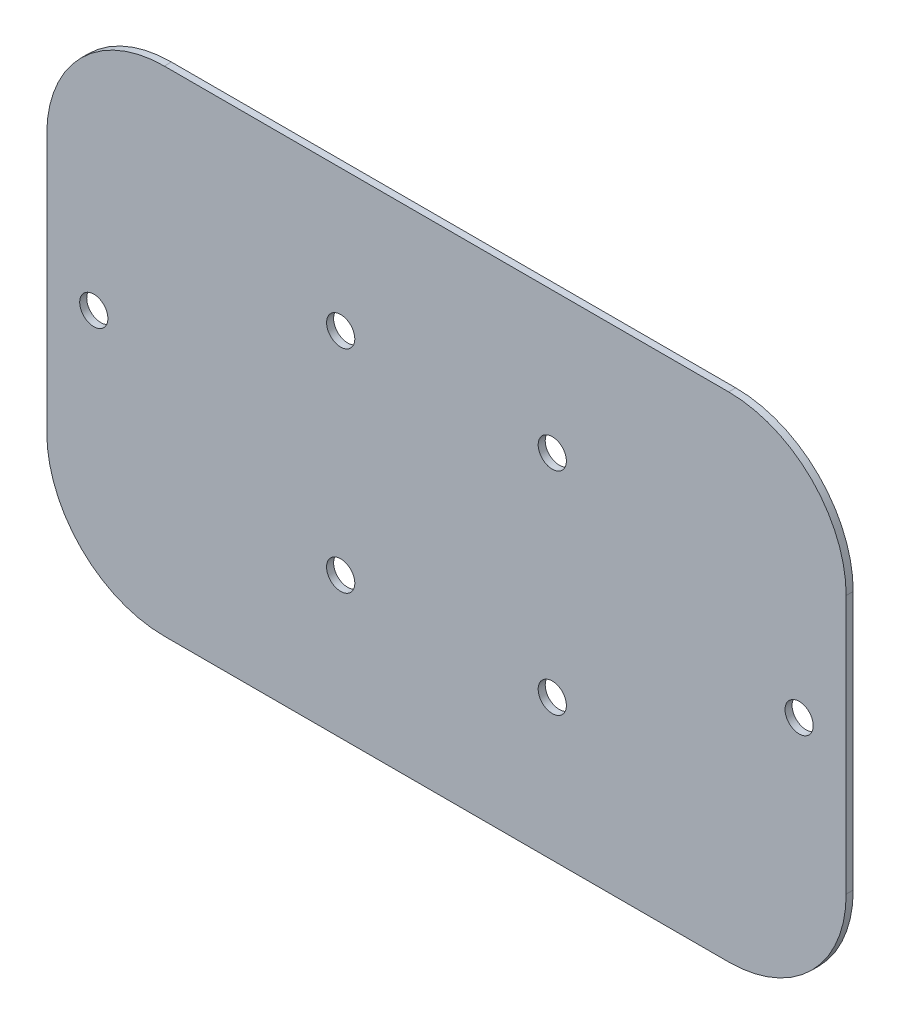
ISO-10303-21;
HEADER;
FILE_DESCRIPTION(('STEP AP214'),'2;1');
FILE_NAME('part.step','',(''),(''),'','','');
FILE_SCHEMA(('AUTOMOTIVE_DESIGN { 1 0 10303 214 1 1 1 1 }'));
ENDSEC;
DATA;
#1=APPLICATION_CONTEXT('core data for automotive mechanical design processes');
#2=APPLICATION_PROTOCOL_DEFINITION('international standard','automotive_design',2000,#1);
#3=PRODUCT_CONTEXT('',#1,'mechanical');
#4=PRODUCT('Part','Part','',(#3));
#5=PRODUCT_RELATED_PRODUCT_CATEGORY('part','',(#4));
#6=PRODUCT_DEFINITION_FORMATION('','',#4);
#7=PRODUCT_DEFINITION_CONTEXT('part definition',#1,'design');
#8=PRODUCT_DEFINITION('design','',#6,#7);
#9=PRODUCT_DEFINITION_SHAPE('','',#8);
#10=(LENGTH_UNIT() NAMED_UNIT(*) SI_UNIT(.MILLI.,.METRE.));
#11=(NAMED_UNIT(*) PLANE_ANGLE_UNIT() SI_UNIT($,.RADIAN.));
#12=(NAMED_UNIT(*) SI_UNIT($,.STERADIAN.) SOLID_ANGLE_UNIT());
#13=UNCERTAINTY_MEASURE_WITH_UNIT(LENGTH_MEASURE(1.E-05),#10,'distance_accuracy_value','');
#14=(GEOMETRIC_REPRESENTATION_CONTEXT(3) GLOBAL_UNCERTAINTY_ASSIGNED_CONTEXT((#13)) GLOBAL_UNIT_ASSIGNED_CONTEXT((#10,
#11,#12)) REPRESENTATION_CONTEXT('',''));
#15=CARTESIAN_POINT('',(0.,0.,0.));
#16=DIRECTION('',(0.,0.,1.));
#17=DIRECTION('',(1.,0.,0.));
#18=AXIS2_PLACEMENT_3D('',#15,#16,#17);
#19=CARTESIAN_POINT('',(-120.,-55.,3.));
#20=DIRECTION('',(0.,0.,-1.));
#21=DIRECTION('',(-1.,0.,0.));
#22=AXIS2_PLACEMENT_3D('',#19,#20,#21);
#23=CYLINDRICAL_SURFACE('',#22,50.);
#24=CARTESIAN_POINT('',(-120.,-55.,0.));
#25=DIRECTION('',(0.,0.,1.));
#26=DIRECTION('',(-1.,0.,0.));
#27=AXIS2_PLACEMENT_3D('',#24,#25,#26);
#28=CIRCLE('',#27,50.);
#29=CARTESIAN_POINT('',(-170.,-55.,0.));
#30=VERTEX_POINT('',#29);
#31=CARTESIAN_POINT('',(-120.,-105.,0.));
#32=VERTEX_POINT('',#31);
#33=EDGE_CURVE('E130',#30,#32,#28,.T.);
#34=ORIENTED_EDGE('',*,*,#33,.T.);
#35=DIRECTION('',(0.,0.,-1.));
#36=VECTOR('',#35,1.);
#37=CARTESIAN_POINT('',(-120.,-105.,3.));
#38=LINE('',#37,#36);
#39=CARTESIAN_POINT('',(-120.,-105.,3.));
#40=VERTEX_POINT('',#39);
#41=EDGE_CURVE('E11',#40,#32,#38,.T.);
#42=ORIENTED_EDGE('',*,*,#41,.F.);
#43=CARTESIAN_POINT('',(-120.,-55.,3.));
#44=DIRECTION('',(0.,0.,1.));
#45=DIRECTION('',(-1.,0.,0.));
#46=AXIS2_PLACEMENT_3D('',#43,#44,#45);
#47=CIRCLE('',#46,50.);
#48=CARTESIAN_POINT('',(-170.,-55.,3.));
#49=VERTEX_POINT('',#48);
#50=EDGE_CURVE('E145',#49,#40,#47,.T.);
#51=ORIENTED_EDGE('',*,*,#50,.F.);
#52=DIRECTION('',(0.,0.,-1.));
#53=VECTOR('',#52,1.);
#54=CARTESIAN_POINT('',(-170.,-55.,3.));
#55=LINE('',#54,#53);
#56=EDGE_CURVE('E126',#49,#30,#55,.T.);
#57=ORIENTED_EDGE('',*,*,#56,.T.);
#58=EDGE_LOOP('',(#34,#42,#51,#57));
#59=FACE_BOUND('',#58,.T.);
#60=ADVANCED_FACE('F34',(#59),#23,.T.);
#61=CARTESIAN_POINT('',(-120.,-105.,3.));
#62=DIRECTION('',(0.,1.,0.));
#63=DIRECTION('',(0.,0.,1.));
#64=AXIS2_PLACEMENT_3D('',#61,#62,#63);
#65=PLANE('',#64);
#66=DIRECTION('',(1.,0.,0.));
#67=VECTOR('',#66,1.);
#68=CARTESIAN_POINT('',(-120.,-105.,0.));
#69=LINE('',#68,#67);
#70=CARTESIAN_POINT('',(120.,-105.,0.));
#71=VERTEX_POINT('',#70);
#72=EDGE_CURVE('E133',#32,#71,#69,.T.);
#73=ORIENTED_EDGE('',*,*,#72,.T.);
#74=DIRECTION('',(0.,0.,-1.));
#75=VECTOR('',#74,1.);
#76=CARTESIAN_POINT('',(120.,-105.,3.));
#77=LINE('',#76,#75);
#78=CARTESIAN_POINT('',(120.,-105.,3.));
#79=VERTEX_POINT('',#78);
#80=EDGE_CURVE('E42',#79,#71,#77,.T.);
#81=ORIENTED_EDGE('',*,*,#80,.F.);
#82=DIRECTION('',(1.,0.,0.));
#83=VECTOR('',#82,1.);
#84=CARTESIAN_POINT('',(-120.,-105.,3.));
#85=LINE('',#84,#83);
#86=EDGE_CURVE('E93',#40,#79,#85,.T.);
#87=ORIENTED_EDGE('',*,*,#86,.F.);
#88=ORIENTED_EDGE('',*,*,#41,.T.);
#89=EDGE_LOOP('',(#73,#81,#87,#88));
#90=FACE_BOUND('',#89,.T.);
#91=ADVANCED_FACE('F243',(#90),#65,.F.);
#92=CARTESIAN_POINT('',(120.,-55.,3.));
#93=DIRECTION('',(0.,0.,-1.));
#94=DIRECTION('',(-1.,0.,0.));
#95=AXIS2_PLACEMENT_3D('',#92,#93,#94);
#96=CYLINDRICAL_SURFACE('',#95,50.);
#97=CARTESIAN_POINT('',(120.,-55.,0.));
#98=DIRECTION('',(0.,0.,1.));
#99=DIRECTION('',(1.,0.,0.));
#100=AXIS2_PLACEMENT_3D('',#97,#98,#99);
#101=CIRCLE('',#100,50.);
#102=CARTESIAN_POINT('',(170.,-55.,0.));
#103=VERTEX_POINT('',#102);
#104=EDGE_CURVE('E136',#71,#103,#101,.T.);
#105=ORIENTED_EDGE('',*,*,#104,.T.);
#106=DIRECTION('',(0.,0.,-1.));
#107=VECTOR('',#106,1.);
#108=CARTESIAN_POINT('',(170.,-55.,3.));
#109=LINE('',#108,#107);
#110=CARTESIAN_POINT('',(170.,-55.,3.));
#111=VERTEX_POINT('',#110);
#112=EDGE_CURVE('E152',#111,#103,#109,.T.);
#113=ORIENTED_EDGE('',*,*,#112,.F.);
#114=CARTESIAN_POINT('',(120.,-55.,3.));
#115=DIRECTION('',(0.,0.,1.));
#116=DIRECTION('',(1.,0.,0.));
#117=AXIS2_PLACEMENT_3D('',#114,#115,#116);
#118=CIRCLE('',#117,50.);
#119=EDGE_CURVE('E160',#79,#111,#118,.T.);
#120=ORIENTED_EDGE('',*,*,#119,.F.);
#121=ORIENTED_EDGE('',*,*,#80,.T.);
#122=EDGE_LOOP('',(#105,#113,#120,#121));
#123=FACE_BOUND('',#122,.T.);
#124=ADVANCED_FACE('F158',(#123),#96,.T.);
#125=CARTESIAN_POINT('',(170.,-55.,3.));
#126=DIRECTION('',(-1.,0.,0.));
#127=DIRECTION('',(0.,0.,1.));
#128=AXIS2_PLACEMENT_3D('',#125,#126,#127);
#129=PLANE('',#128);
#130=DIRECTION('',(0.,1.,0.));
#131=VECTOR('',#130,1.);
#132=CARTESIAN_POINT('',(170.,-55.,0.));
#133=LINE('',#132,#131);
#134=CARTESIAN_POINT('',(170.,55.,0.));
#135=VERTEX_POINT('',#134);
#136=EDGE_CURVE('E138',#103,#135,#133,.T.);
#137=ORIENTED_EDGE('',*,*,#136,.T.);
#138=DIRECTION('',(0.,0.,-1.));
#139=VECTOR('',#138,1.);
#140=CARTESIAN_POINT('',(170.,55.,3.));
#141=LINE('',#140,#139);
#142=CARTESIAN_POINT('',(170.,55.,3.));
#143=VERTEX_POINT('',#142);
#144=EDGE_CURVE('E149',#143,#135,#141,.T.);
#145=ORIENTED_EDGE('',*,*,#144,.F.);
#146=DIRECTION('',(0.,1.,0.));
#147=VECTOR('',#146,1.);
#148=CARTESIAN_POINT('',(170.,-55.,3.));
#149=LINE('',#148,#147);
#150=EDGE_CURVE('E172',#111,#143,#149,.T.);
#151=ORIENTED_EDGE('',*,*,#150,.F.);
#152=ORIENTED_EDGE('',*,*,#112,.T.);
#153=EDGE_LOOP('',(#137,#145,#151,#152));
#154=FACE_BOUND('',#153,.T.);
#155=ADVANCED_FACE('F168',(#154),#129,.F.);
#156=CARTESIAN_POINT('',(120.,55.,3.));
#157=DIRECTION('',(0.,0.,-1.));
#158=DIRECTION('',(-1.,0.,0.));
#159=AXIS2_PLACEMENT_3D('',#156,#157,#158);
#160=CYLINDRICAL_SURFACE('',#159,50.);
#161=CARTESIAN_POINT('',(120.,55.,0.));
#162=DIRECTION('',(0.,0.,1.));
#163=DIRECTION('',(-1.,0.,0.));
#164=AXIS2_PLACEMENT_3D('',#161,#162,#163);
#165=CIRCLE('',#164,50.);
#166=CARTESIAN_POINT('',(120.,105.,0.));
#167=VERTEX_POINT('',#166);
#168=EDGE_CURVE('E140',#135,#167,#165,.T.);
#169=ORIENTED_EDGE('',*,*,#168,.T.);
#170=DIRECTION('',(0.,0.,-1.));
#171=VECTOR('',#170,1.);
#172=CARTESIAN_POINT('',(120.,105.,3.));
#173=LINE('',#172,#171);
#174=CARTESIAN_POINT('',(120.,105.,3.));
#175=VERTEX_POINT('',#174);
#176=EDGE_CURVE('E121',#175,#167,#173,.T.);
#177=ORIENTED_EDGE('',*,*,#176,.F.);
#178=CARTESIAN_POINT('',(120.,55.,3.));
#179=DIRECTION('',(0.,0.,1.));
#180=DIRECTION('',(-1.,0.,0.));
#181=AXIS2_PLACEMENT_3D('',#178,#179,#180);
#182=CIRCLE('',#181,50.);
#183=EDGE_CURVE('E112',#143,#175,#182,.T.);
#184=ORIENTED_EDGE('',*,*,#183,.F.);
#185=ORIENTED_EDGE('',*,*,#144,.T.);
#186=EDGE_LOOP('',(#169,#177,#184,#185));
#187=FACE_BOUND('',#186,.T.);
#188=ADVANCED_FACE('F171',(#187),#160,.T.);
#189=CARTESIAN_POINT('',(-120.,105.,3.));
#190=DIRECTION('',(0.,-1.,0.));
#191=DIRECTION('',(0.,0.,-1.));
#192=AXIS2_PLACEMENT_3D('',#189,#190,#191);
#193=PLANE('',#192);
#194=DIRECTION('',(-1.,0.,0.));
#195=VECTOR('',#194,1.);
#196=CARTESIAN_POINT('',(-120.,105.,0.));
#197=LINE('',#196,#195);
#198=CARTESIAN_POINT('',(-120.,105.,0.));
#199=VERTEX_POINT('',#198);
#200=EDGE_CURVE('E120',#167,#199,#197,.T.);
#201=ORIENTED_EDGE('',*,*,#200,.T.);
#202=DIRECTION('',(0.,0.,-1.));
#203=VECTOR('',#202,1.);
#204=CARTESIAN_POINT('',(-120.,105.,3.));
#205=LINE('',#204,#203);
#206=CARTESIAN_POINT('',(-120.,105.,3.));
#207=VERTEX_POINT('',#206);
#208=EDGE_CURVE('E117',#207,#199,#205,.T.);
#209=ORIENTED_EDGE('',*,*,#208,.F.);
#210=DIRECTION('',(-1.,0.,0.));
#211=VECTOR('',#210,1.);
#212=CARTESIAN_POINT('',(-120.,105.,3.));
#213=LINE('',#212,#211);
#214=EDGE_CURVE('E106',#175,#207,#213,.T.);
#215=ORIENTED_EDGE('',*,*,#214,.F.);
#216=ORIENTED_EDGE('',*,*,#176,.T.);
#217=EDGE_LOOP('',(#201,#209,#215,#216));
#218=FACE_BOUND('',#217,.T.);
#219=ADVANCED_FACE('F118',(#218),#193,.F.);
#220=CARTESIAN_POINT('',(-120.,55.,3.));
#221=DIRECTION('',(0.,0.,-1.));
#222=DIRECTION('',(-1.,0.,0.));
#223=AXIS2_PLACEMENT_3D('',#220,#221,#222);
#224=CYLINDRICAL_SURFACE('',#223,50.);
#225=CARTESIAN_POINT('',(-120.,55.,0.));
#226=DIRECTION('',(0.,0.,1.));
#227=DIRECTION('',(-1.,0.,0.));
#228=AXIS2_PLACEMENT_3D('',#225,#226,#227);
#229=CIRCLE('',#228,50.);
#230=CARTESIAN_POINT('',(-170.,55.,0.));
#231=VERTEX_POINT('',#230);
#232=EDGE_CURVE('E79',#199,#231,#229,.T.);
#233=ORIENTED_EDGE('',*,*,#232,.T.);
#234=DIRECTION('',(0.,0.,-1.));
#235=VECTOR('',#234,1.);
#236=CARTESIAN_POINT('',(-170.,55.,3.));
#237=LINE('',#236,#235);
#238=CARTESIAN_POINT('',(-170.,55.,3.));
#239=VERTEX_POINT('',#238);
#240=EDGE_CURVE('E122',#239,#231,#237,.T.);
#241=ORIENTED_EDGE('',*,*,#240,.F.);
#242=CARTESIAN_POINT('',(-120.,55.,3.));
#243=DIRECTION('',(0.,0.,1.));
#244=DIRECTION('',(-1.,0.,0.));
#245=AXIS2_PLACEMENT_3D('',#242,#243,#244);
#246=CIRCLE('',#245,50.);
#247=EDGE_CURVE('E110',#207,#239,#246,.T.);
#248=ORIENTED_EDGE('',*,*,#247,.F.);
#249=ORIENTED_EDGE('',*,*,#208,.T.);
#250=EDGE_LOOP('',(#233,#241,#248,#249));
#251=FACE_BOUND('',#250,.T.);
#252=ADVANCED_FACE('F124',(#251),#224,.T.);
#253=CARTESIAN_POINT('',(-170.,-55.,3.));
#254=DIRECTION('',(1.,0.,0.));
#255=DIRECTION('',(0.,0.,-1.));
#256=AXIS2_PLACEMENT_3D('',#253,#254,#255);
#257=PLANE('',#256);
#258=DIRECTION('',(0.,-1.,0.));
#259=VECTOR('',#258,1.);
#260=CARTESIAN_POINT('',(-170.,-55.,0.));
#261=LINE('',#260,#259);
#262=EDGE_CURVE('E85',#231,#30,#261,.T.);
#263=ORIENTED_EDGE('',*,*,#262,.T.);
#264=ORIENTED_EDGE('',*,*,#56,.F.);
#265=DIRECTION('',(0.,-1.,0.));
#266=VECTOR('',#265,1.);
#267=CARTESIAN_POINT('',(-170.,-55.,3.));
#268=LINE('',#267,#266);
#269=EDGE_CURVE('E50',#239,#49,#268,.T.);
#270=ORIENTED_EDGE('',*,*,#269,.F.);
#271=ORIENTED_EDGE('',*,*,#240,.T.);
#272=EDGE_LOOP('',(#263,#264,#270,#271));
#273=FACE_BOUND('',#272,.T.);
#274=ADVANCED_FACE('F250',(#273),#257,.F.);
#275=CARTESIAN_POINT('',(-120.,-55.,3.));
#276=DIRECTION('',(0.,0.,-1.));
#277=DIRECTION('',(-1.,0.,0.));
#278=AXIS2_PLACEMENT_3D('',#275,#276,#277);
#279=PLANE('',#278);
#280=CARTESIAN_POINT('',(-45.,45.,3.));
#281=DIRECTION('',(0.,0.,-1.));
#282=DIRECTION('',(-1.,0.,0.));
#283=AXIS2_PLACEMENT_3D('',#280,#281,#282);
#284=CIRCLE('',#283,5.99999999999991);
#285=CARTESIAN_POINT('',(-50.9999999999999,45.,3.));
#286=VERTEX_POINT('',#285);
#287=EDGE_CURVE('E207',#286,#286,#284,.T.);
#288=ORIENTED_EDGE('',*,*,#287,.T.);
#289=EDGE_LOOP('',(#288));
#290=FACE_BOUND('',#289,.T.);
#291=CARTESIAN_POINT('',(45.,45.,3.));
#292=DIRECTION('',(0.,0.,-1.));
#293=DIRECTION('',(-1.,0.,0.));
#294=AXIS2_PLACEMENT_3D('',#291,#292,#293);
#295=CIRCLE('',#294,5.99999999999991);
#296=CARTESIAN_POINT('',(39.0000000000001,45.,3.));
#297=VERTEX_POINT('',#296);
#298=EDGE_CURVE('E201',#297,#297,#295,.T.);
#299=ORIENTED_EDGE('',*,*,#298,.T.);
#300=EDGE_LOOP('',(#299));
#301=FACE_BOUND('',#300,.T.);
#302=CARTESIAN_POINT('',(-45.,-45.,3.));
#303=DIRECTION('',(0.,0.,-1.));
#304=DIRECTION('',(-1.,0.,0.));
#305=AXIS2_PLACEMENT_3D('',#302,#303,#304);
#306=CIRCLE('',#305,5.99999999999991);
#307=CARTESIAN_POINT('',(-50.9999999999999,-45.,3.));
#308=VERTEX_POINT('',#307);
#309=EDGE_CURVE('E195',#308,#308,#306,.T.);
#310=ORIENTED_EDGE('',*,*,#309,.T.);
#311=EDGE_LOOP('',(#310));
#312=FACE_BOUND('',#311,.T.);
#313=CARTESIAN_POINT('',(45.,-45.,3.));
#314=DIRECTION('',(0.,0.,-1.));
#315=DIRECTION('',(-1.,0.,0.));
#316=AXIS2_PLACEMENT_3D('',#313,#314,#315);
#317=CIRCLE('',#316,5.99999999999991);
#318=CARTESIAN_POINT('',(39.0000000000001,-45.,3.));
#319=VERTEX_POINT('',#318);
#320=EDGE_CURVE('E189',#319,#319,#317,.T.);
#321=ORIENTED_EDGE('',*,*,#320,.T.);
#322=EDGE_LOOP('',(#321));
#323=FACE_BOUND('',#322,.T.);
#324=CARTESIAN_POINT('',(150.,0.,3.));
#325=DIRECTION('',(0.,0.,-1.));
#326=DIRECTION('',(-1.,0.,0.));
#327=AXIS2_PLACEMENT_3D('',#324,#325,#326);
#328=CIRCLE('',#327,5.99999999999992);
#329=CARTESIAN_POINT('',(144.,0.,3.));
#330=VERTEX_POINT('',#329);
#331=EDGE_CURVE('E183',#330,#330,#328,.T.);
#332=ORIENTED_EDGE('',*,*,#331,.T.);
#333=EDGE_LOOP('',(#332));
#334=FACE_BOUND('',#333,.T.);
#335=CARTESIAN_POINT('',(-150.,0.,3.));
#336=DIRECTION('',(0.,0.,-1.));
#337=DIRECTION('',(-1.,0.,0.));
#338=AXIS2_PLACEMENT_3D('',#335,#336,#337);
#339=CIRCLE('',#338,5.99999999999992);
#340=CARTESIAN_POINT('',(-156.,0.,3.));
#341=VERTEX_POINT('',#340);
#342=EDGE_CURVE('E134',#341,#341,#339,.T.);
#343=ORIENTED_EDGE('',*,*,#342,.T.);
#344=EDGE_LOOP('',(#343));
#345=FACE_BOUND('',#344,.T.);
#346=ORIENTED_EDGE('',*,*,#50,.T.);
#347=ORIENTED_EDGE('',*,*,#86,.T.);
#348=ORIENTED_EDGE('',*,*,#119,.T.);
#349=ORIENTED_EDGE('',*,*,#150,.T.);
#350=ORIENTED_EDGE('',*,*,#183,.T.);
#351=ORIENTED_EDGE('',*,*,#214,.T.);
#352=ORIENTED_EDGE('',*,*,#247,.T.);
#353=ORIENTED_EDGE('',*,*,#269,.T.);
#354=EDGE_LOOP('',(#346,#347,#348,#349,#350,#351,#352,#353));
#355=FACE_BOUND('',#354,.T.);
#356=ADVANCED_FACE('F108',(#290,#301,#312,#323,#334,#345,#355),#279,.F.);
#357=CARTESIAN_POINT('',(-120.,-55.,0.));
#358=DIRECTION('',(0.,0.,-1.));
#359=DIRECTION('',(-1.,0.,0.));
#360=AXIS2_PLACEMENT_3D('',#357,#358,#359);
#361=PLANE('',#360);
#362=CARTESIAN_POINT('',(-45.,45.,0.));
#363=DIRECTION('',(0.,0.,-1.));
#364=DIRECTION('',(-1.,0.,0.));
#365=AXIS2_PLACEMENT_3D('',#362,#363,#364);
#366=CIRCLE('',#365,5.99999999999998);
#367=CARTESIAN_POINT('',(-51.,45.,0.));
#368=VERTEX_POINT('',#367);
#369=EDGE_CURVE('E210',#368,#368,#366,.T.);
#370=ORIENTED_EDGE('',*,*,#369,.F.);
#371=EDGE_LOOP('',(#370));
#372=FACE_BOUND('',#371,.T.);
#373=CARTESIAN_POINT('',(45.,45.,0.));
#374=DIRECTION('',(0.,0.,-1.));
#375=DIRECTION('',(-1.,0.,0.));
#376=AXIS2_PLACEMENT_3D('',#373,#374,#375);
#377=CIRCLE('',#376,5.99999999999998);
#378=CARTESIAN_POINT('',(39.,45.,0.));
#379=VERTEX_POINT('',#378);
#380=EDGE_CURVE('E204',#379,#379,#377,.T.);
#381=ORIENTED_EDGE('',*,*,#380,.F.);
#382=EDGE_LOOP('',(#381));
#383=FACE_BOUND('',#382,.T.);
#384=CARTESIAN_POINT('',(-45.,-45.,0.));
#385=DIRECTION('',(0.,0.,-1.));
#386=DIRECTION('',(-1.,0.,0.));
#387=AXIS2_PLACEMENT_3D('',#384,#385,#386);
#388=CIRCLE('',#387,5.99999999999998);
#389=CARTESIAN_POINT('',(-51.,-45.,0.));
#390=VERTEX_POINT('',#389);
#391=EDGE_CURVE('E198',#390,#390,#388,.T.);
#392=ORIENTED_EDGE('',*,*,#391,.F.);
#393=EDGE_LOOP('',(#392));
#394=FACE_BOUND('',#393,.T.);
#395=CARTESIAN_POINT('',(45.,-45.,0.));
#396=DIRECTION('',(0.,0.,-1.));
#397=DIRECTION('',(-1.,0.,0.));
#398=AXIS2_PLACEMENT_3D('',#395,#396,#397);
#399=CIRCLE('',#398,5.99999999999998);
#400=CARTESIAN_POINT('',(39.,-45.,0.));
#401=VERTEX_POINT('',#400);
#402=EDGE_CURVE('E192',#401,#401,#399,.T.);
#403=ORIENTED_EDGE('',*,*,#402,.F.);
#404=EDGE_LOOP('',(#403));
#405=FACE_BOUND('',#404,.T.);
#406=CARTESIAN_POINT('',(150.,0.,0.));
#407=DIRECTION('',(0.,0.,-1.));
#408=DIRECTION('',(-1.,0.,0.));
#409=AXIS2_PLACEMENT_3D('',#406,#407,#408);
#410=CIRCLE('',#409,5.99999999999998);
#411=CARTESIAN_POINT('',(144.,0.,0.));
#412=VERTEX_POINT('',#411);
#413=EDGE_CURVE('E186',#412,#412,#410,.T.);
#414=ORIENTED_EDGE('',*,*,#413,.F.);
#415=EDGE_LOOP('',(#414));
#416=FACE_BOUND('',#415,.T.);
#417=CARTESIAN_POINT('',(-150.,0.,0.));
#418=DIRECTION('',(0.,0.,-1.));
#419=DIRECTION('',(-1.,0.,0.));
#420=AXIS2_PLACEMENT_3D('',#417,#418,#419);
#421=CIRCLE('',#420,5.99999999999998);
#422=CARTESIAN_POINT('',(-156.,0.,0.));
#423=VERTEX_POINT('',#422);
#424=EDGE_CURVE('E180',#423,#423,#421,.T.);
#425=ORIENTED_EDGE('',*,*,#424,.F.);
#426=EDGE_LOOP('',(#425));
#427=FACE_BOUND('',#426,.T.);
#428=ORIENTED_EDGE('',*,*,#33,.F.);
#429=ORIENTED_EDGE('',*,*,#262,.F.);
#430=ORIENTED_EDGE('',*,*,#232,.F.);
#431=ORIENTED_EDGE('',*,*,#200,.F.);
#432=ORIENTED_EDGE('',*,*,#168,.F.);
#433=ORIENTED_EDGE('',*,*,#136,.F.);
#434=ORIENTED_EDGE('',*,*,#104,.F.);
#435=ORIENTED_EDGE('',*,*,#72,.F.);
#436=EDGE_LOOP('',(#428,#429,#430,#431,#432,#433,#434,#435));
#437=FACE_BOUND('',#436,.T.);
#438=ADVANCED_FACE('F164',(#372,#383,#394,#405,#416,#427,#437),#361,.T.);
#439=CARTESIAN_POINT('',(-150.,0.,0.));
#440=DIRECTION('',(0.,0.,-1.));
#441=DIRECTION('',(-1.,0.,0.));
#442=AXIS2_PLACEMENT_3D('',#439,#440,#441);
#443=CYLINDRICAL_SURFACE('',#442,5.99999999999995);
#444=ORIENTED_EDGE('',*,*,#342,.F.);
#445=EDGE_LOOP('',(#444));
#446=FACE_BOUND('',#445,.T.);
#447=ORIENTED_EDGE('',*,*,#424,.T.);
#448=EDGE_LOOP('',(#447));
#449=FACE_BOUND('',#448,.T.);
#450=ADVANCED_FACE('F218',(#446,#449),#443,.F.);
#451=CARTESIAN_POINT('',(150.,0.,0.));
#452=DIRECTION('',(0.,0.,-1.));
#453=DIRECTION('',(-1.,0.,0.));
#454=AXIS2_PLACEMENT_3D('',#451,#452,#453);
#455=CYLINDRICAL_SURFACE('',#454,5.99999999999995);
#456=ORIENTED_EDGE('',*,*,#331,.F.);
#457=EDGE_LOOP('',(#456));
#458=FACE_BOUND('',#457,.T.);
#459=ORIENTED_EDGE('',*,*,#413,.T.);
#460=EDGE_LOOP('',(#459));
#461=FACE_BOUND('',#460,.T.);
#462=ADVANCED_FACE('F231',(#458,#461),#455,.F.);
#463=CARTESIAN_POINT('',(45.,-45.,0.));
#464=DIRECTION('',(0.,0.,-1.));
#465=DIRECTION('',(-1.,0.,0.));
#466=AXIS2_PLACEMENT_3D('',#463,#464,#465);
#467=CYLINDRICAL_SURFACE('',#466,5.99999999999995);
#468=ORIENTED_EDGE('',*,*,#320,.F.);
#469=EDGE_LOOP('',(#468));
#470=FACE_BOUND('',#469,.T.);
#471=ORIENTED_EDGE('',*,*,#402,.T.);
#472=EDGE_LOOP('',(#471));
#473=FACE_BOUND('',#472,.T.);
#474=ADVANCED_FACE('F237',(#470,#473),#467,.F.);
#475=CARTESIAN_POINT('',(-45.,-45.,0.));
#476=DIRECTION('',(0.,0.,-1.));
#477=DIRECTION('',(-1.,0.,0.));
#478=AXIS2_PLACEMENT_3D('',#475,#476,#477);
#479=CYLINDRICAL_SURFACE('',#478,5.99999999999995);
#480=ORIENTED_EDGE('',*,*,#309,.F.);
#481=EDGE_LOOP('',(#480));
#482=FACE_BOUND('',#481,.T.);
#483=ORIENTED_EDGE('',*,*,#391,.T.);
#484=EDGE_LOOP('',(#483));
#485=FACE_BOUND('',#484,.T.);
#486=ADVANCED_FACE('F322',(#482,#485),#479,.F.);
#487=CARTESIAN_POINT('',(45.,45.,0.));
#488=DIRECTION('',(0.,0.,-1.));
#489=DIRECTION('',(-1.,0.,0.));
#490=AXIS2_PLACEMENT_3D('',#487,#488,#489);
#491=CYLINDRICAL_SURFACE('',#490,5.99999999999995);
#492=ORIENTED_EDGE('',*,*,#298,.F.);
#493=EDGE_LOOP('',(#492));
#494=FACE_BOUND('',#493,.T.);
#495=ORIENTED_EDGE('',*,*,#380,.T.);
#496=EDGE_LOOP('',(#495));
#497=FACE_BOUND('',#496,.T.);
#498=ADVANCED_FACE('F332',(#494,#497),#491,.F.);
#499=CARTESIAN_POINT('',(-45.,45.,0.));
#500=DIRECTION('',(0.,0.,-1.));
#501=DIRECTION('',(-1.,0.,0.));
#502=AXIS2_PLACEMENT_3D('',#499,#500,#501);
#503=CYLINDRICAL_SURFACE('',#502,5.99999999999995);
#504=ORIENTED_EDGE('',*,*,#287,.F.);
#505=EDGE_LOOP('',(#504));
#506=FACE_BOUND('',#505,.T.);
#507=ORIENTED_EDGE('',*,*,#369,.T.);
#508=EDGE_LOOP('',(#507));
#509=FACE_BOUND('',#508,.T.);
#510=ADVANCED_FACE('F214',(#506,#509),#503,.F.);
#511=CLOSED_SHELL('',(#60,#91,#124,#155,#188,#219,#252,#274,#356,#438,#450,#462,#474,#486,#498,#510));
#512=MANIFOLD_SOLID_BREP('B2',#511);
#513=ADVANCED_BREP_SHAPE_REPRESENTATION('',(#18,#512),#14);
#514=SHAPE_DEFINITION_REPRESENTATION(#9,#513);
ENDSEC;
END-ISO-10303-21;
